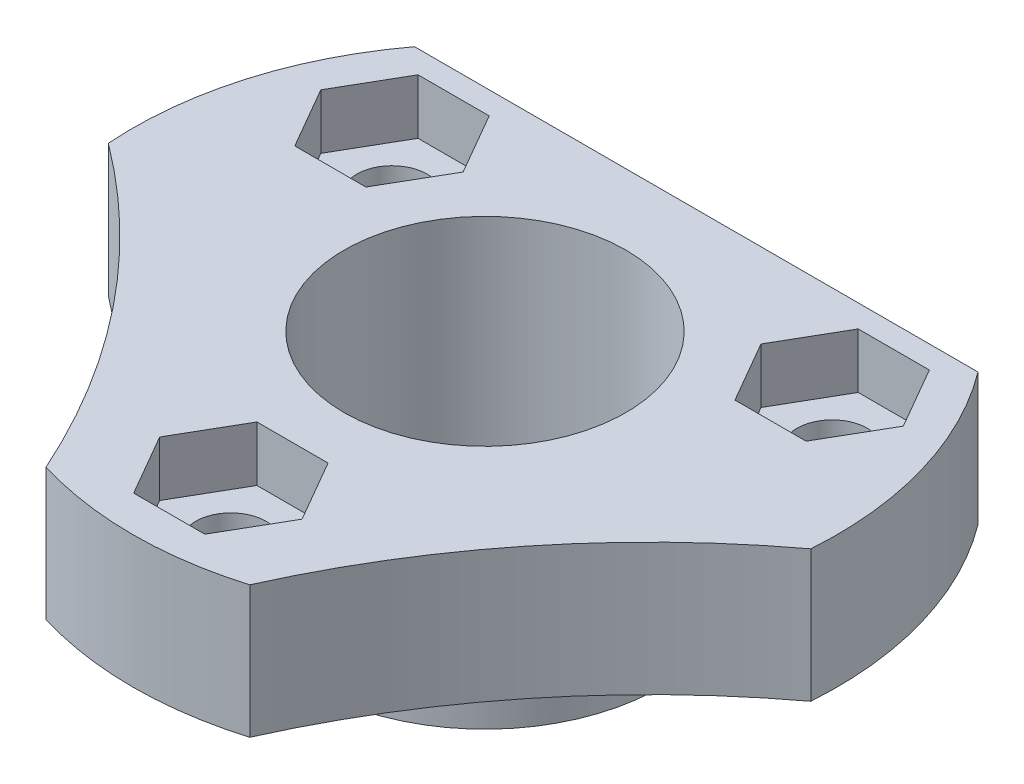
ISO-10303-21;
HEADER;
FILE_DESCRIPTION(('STEP AP214'),'2;1');
FILE_NAME('part.step','',(''),(''),'','','');
FILE_SCHEMA(('AUTOMOTIVE_DESIGN { 1 0 10303 214 1 1 1 1 }'));
ENDSEC;
DATA;
#1=APPLICATION_CONTEXT('core data for automotive mechanical design processes');
#2=APPLICATION_PROTOCOL_DEFINITION('international standard','automotive_design',2000,#1);
#3=PRODUCT_CONTEXT('',#1,'mechanical');
#4=PRODUCT('Part','Part','',(#3));
#5=PRODUCT_RELATED_PRODUCT_CATEGORY('part','',(#4));
#6=PRODUCT_DEFINITION_FORMATION('','',#4);
#7=PRODUCT_DEFINITION_CONTEXT('part definition',#1,'design');
#8=PRODUCT_DEFINITION('design','',#6,#7);
#9=PRODUCT_DEFINITION_SHAPE('','',#8);
#10=(LENGTH_UNIT() NAMED_UNIT(*) SI_UNIT(.MILLI.,.METRE.));
#11=(NAMED_UNIT(*) PLANE_ANGLE_UNIT() SI_UNIT($,.RADIAN.));
#12=(NAMED_UNIT(*) SI_UNIT($,.STERADIAN.) SOLID_ANGLE_UNIT());
#13=UNCERTAINTY_MEASURE_WITH_UNIT(LENGTH_MEASURE(1.E-05),#10,'distance_accuracy_value','');
#14=(GEOMETRIC_REPRESENTATION_CONTEXT(3) GLOBAL_UNCERTAINTY_ASSIGNED_CONTEXT((#13)) GLOBAL_UNIT_ASSIGNED_CONTEXT((#10,
#11,#12)) REPRESENTATION_CONTEXT('',''));
#15=CARTESIAN_POINT('',(0.,0.,0.));
#16=DIRECTION('',(0.,0.,1.));
#17=DIRECTION('',(1.,0.,0.));
#18=AXIS2_PLACEMENT_3D('',#15,#16,#17);
#19=CARTESIAN_POINT('',(0.,6.,11.5470053837925));
#20=DIRECTION('',(0.,-1.,0.));
#21=DIRECTION('',(0.,0.,-1.));
#22=AXIS2_PLACEMENT_3D('',#19,#20,#21);
#23=CYLINDRICAL_SURFACE('',#22,1.6);
#24=CARTESIAN_POINT('',(0.,0.,11.5470053837925));
#25=DIRECTION('',(0.,1.,0.));
#26=DIRECTION('',(0.,0.,1.));
#27=AXIS2_PLACEMENT_3D('',#24,#25,#26);
#28=CIRCLE('',#27,1.6);
#29=CARTESIAN_POINT('',(0.,0.,13.1470053837925));
#30=VERTEX_POINT('',#29);
#31=EDGE_CURVE('E368',#30,#30,#28,.T.);
#32=ORIENTED_EDGE('',*,*,#31,.F.);
#33=EDGE_LOOP('',(#32));
#34=FACE_BOUND('',#33,.T.);
#35=CARTESIAN_POINT('',(0.,3.5,11.5470053837925));
#36=DIRECTION('',(0.,1.,0.));
#37=DIRECTION('',(0.,0.,1.));
#38=AXIS2_PLACEMENT_3D('',#35,#36,#37);
#39=CIRCLE('',#38,1.6);
#40=CARTESIAN_POINT('',(0.,3.5,13.1470053837925));
#41=VERTEX_POINT('',#40);
#42=EDGE_CURVE('E36',#41,#41,#39,.T.);
#43=ORIENTED_EDGE('',*,*,#42,.T.);
#44=EDGE_LOOP('',(#43));
#45=FACE_BOUND('',#44,.T.);
#46=ADVANCED_FACE('F32',(#34,#45),#23,.F.);
#47=CARTESIAN_POINT('',(-10.,6.,-5.77350269189626));
#48=DIRECTION('',(0.,-1.,0.));
#49=DIRECTION('',(0.,0.,-1.));
#50=AXIS2_PLACEMENT_3D('',#47,#48,#49);
#51=CYLINDRICAL_SURFACE('',#50,1.6);
#52=CARTESIAN_POINT('',(-10.,0.,-5.77350269189626));
#53=DIRECTION('',(0.,1.,0.));
#54=DIRECTION('',(0.,0.,1.));
#55=AXIS2_PLACEMENT_3D('',#52,#53,#54);
#56=CIRCLE('',#55,1.6);
#57=CARTESIAN_POINT('',(-10.,0.,-4.17350269189626));
#58=VERTEX_POINT('',#57);
#59=EDGE_CURVE('E365',#58,#58,#56,.T.);
#60=ORIENTED_EDGE('',*,*,#59,.F.);
#61=EDGE_LOOP('',(#60));
#62=FACE_BOUND('',#61,.T.);
#63=CARTESIAN_POINT('',(-10.,3.5,-5.77350269189626));
#64=DIRECTION('',(0.,1.,0.));
#65=DIRECTION('',(0.,0.,1.));
#66=AXIS2_PLACEMENT_3D('',#63,#64,#65);
#67=CIRCLE('',#66,1.6);
#68=CARTESIAN_POINT('',(-10.,3.5,-4.17350269189626));
#69=VERTEX_POINT('',#68);
#70=EDGE_CURVE('E411',#69,#69,#67,.T.);
#71=ORIENTED_EDGE('',*,*,#70,.T.);
#72=EDGE_LOOP('',(#71));
#73=FACE_BOUND('',#72,.T.);
#74=ADVANCED_FACE('F480',(#62,#73),#51,.F.);
#75=CARTESIAN_POINT('',(10.,6.,-5.77350269189626));
#76=DIRECTION('',(0.,-1.,0.));
#77=DIRECTION('',(0.,0.,-1.));
#78=AXIS2_PLACEMENT_3D('',#75,#76,#77);
#79=CYLINDRICAL_SURFACE('',#78,1.6);
#80=CARTESIAN_POINT('',(10.,0.,-5.77350269189626));
#81=DIRECTION('',(0.,1.,0.));
#82=DIRECTION('',(0.,0.,1.));
#83=AXIS2_PLACEMENT_3D('',#80,#81,#82);
#84=CIRCLE('',#83,1.6);
#85=CARTESIAN_POINT('',(10.,0.,-4.17350269189626));
#86=VERTEX_POINT('',#85);
#87=EDGE_CURVE('E362',#86,#86,#84,.T.);
#88=ORIENTED_EDGE('',*,*,#87,.F.);
#89=EDGE_LOOP('',(#88));
#90=FACE_BOUND('',#89,.T.);
#91=CARTESIAN_POINT('',(10.,3.5,-5.77350269189626));
#92=DIRECTION('',(0.,1.,0.));
#93=DIRECTION('',(0.,0.,1.));
#94=AXIS2_PLACEMENT_3D('',#91,#92,#93);
#95=CIRCLE('',#94,1.6);
#96=CARTESIAN_POINT('',(10.,3.5,-4.17350269189626));
#97=VERTEX_POINT('',#96);
#98=EDGE_CURVE('E243',#97,#97,#95,.T.);
#99=ORIENTED_EDGE('',*,*,#98,.T.);
#100=EDGE_LOOP('',(#99));
#101=FACE_BOUND('',#100,.T.);
#102=ADVANCED_FACE('F485',(#90,#101),#79,.F.);
#103=CARTESIAN_POINT('',(0.,6.,0.));
#104=DIRECTION('',(0.,-1.,0.));
#105=DIRECTION('',(0.,0.,-1.));
#106=AXIS2_PLACEMENT_3D('',#103,#104,#105);
#107=CYLINDRICAL_SURFACE('',#106,16.);
#108=CARTESIAN_POINT('',(0.,6.,0.));
#109=DIRECTION('',(0.,1.,0.));
#110=DIRECTION('',(0.,0.,1.));
#111=AXIS2_PLACEMENT_3D('',#108,#109,#110);
#112=CIRCLE('',#111,16.);
#113=CARTESIAN_POINT('',(-12.8,6.,-9.6));
#114=VERTEX_POINT('',#113);
#115=CARTESIAN_POINT('',(-15.9581501555401,6.,1.15647897224159));
#116=VERTEX_POINT('',#115);
#117=EDGE_CURVE('E378',#114,#116,#112,.T.);
#118=ORIENTED_EDGE('',*,*,#117,.F.);
#119=DIRECTION('',(0.,-1.,0.));
#120=VECTOR('',#119,1.);
#121=CARTESIAN_POINT('',(-12.8,6.,-9.6));
#122=LINE('',#121,#120);
#123=CARTESIAN_POINT('',(-12.8,0.,-9.6));
#124=VERTEX_POINT('',#123);
#125=EDGE_CURVE('E11',#114,#124,#122,.T.);
#126=ORIENTED_EDGE('',*,*,#125,.T.);
#127=CARTESIAN_POINT('',(0.,0.,0.));
#128=DIRECTION('',(0.,1.,0.));
#129=DIRECTION('',(0.,0.,1.));
#130=AXIS2_PLACEMENT_3D('',#127,#128,#129);
#131=CIRCLE('',#130,16.);
#132=CARTESIAN_POINT('',(-15.9581501555401,0.,1.1564789722416));
#133=VERTEX_POINT('',#132);
#134=EDGE_CURVE('E383',#124,#133,#131,.T.);
#135=ORIENTED_EDGE('',*,*,#134,.T.);
#136=DIRECTION('',(0.,1.,0.));
#137=VECTOR('',#136,1.);
#138=CARTESIAN_POINT('',(-15.9581501555401,1.,1.1564789722416));
#139=LINE('',#138,#137);
#140=EDGE_CURVE('E405',#133,#116,#139,.T.);
#141=ORIENTED_EDGE('',*,*,#140,.T.);
#142=EDGE_LOOP('',(#118,#126,#135,#141));
#143=FACE_BOUND('',#142,.T.);
#144=ADVANCED_FACE('F476',(#143),#107,.T.);
#145=CARTESIAN_POINT('',(15.9581501555401,0.,1.15647897224158));
#146=VERTEX_POINT('',#145);
#147=CARTESIAN_POINT('',(12.8,0.,-9.6));
#148=VERTEX_POINT('',#147);
#149=EDGE_CURVE('E379',#146,#148,#131,.T.);
#150=ORIENTED_EDGE('',*,*,#149,.T.);
#151=DIRECTION('',(0.,-1.,0.));
#152=VECTOR('',#151,1.);
#153=CARTESIAN_POINT('',(12.8,6.,-9.6));
#154=LINE('',#153,#152);
#155=CARTESIAN_POINT('',(12.8,6.,-9.6));
#156=VERTEX_POINT('',#155);
#157=EDGE_CURVE('E41',#148,#156,#154,.F.);
#158=ORIENTED_EDGE('',*,*,#157,.T.);
#159=CARTESIAN_POINT('',(15.9581501555401,6.,1.15647897224158));
#160=VERTEX_POINT('',#159);
#161=EDGE_CURVE('E380',#160,#156,#112,.T.);
#162=ORIENTED_EDGE('',*,*,#161,.F.);
#163=DIRECTION('',(0.,1.,0.));
#164=VECTOR('',#163,1.);
#165=CARTESIAN_POINT('',(15.9581501555401,1.,1.15647897224158));
#166=LINE('',#165,#164);
#167=EDGE_CURVE('E396',#160,#146,#166,.F.);
#168=ORIENTED_EDGE('',*,*,#167,.T.);
#169=EDGE_LOOP('',(#150,#158,#162,#168));
#170=FACE_BOUND('',#169,.T.);
#171=ADVANCED_FACE('F477',(#170),#107,.T.);
#172=CARTESIAN_POINT('',(0.,0.,0.));
#173=DIRECTION('',(0.,1.,0.));
#174=DIRECTION('',(0.,0.,1.));
#175=AXIS2_PLACEMENT_3D('',#172,#173,#174);
#176=PLANE('',#175);
#177=CARTESIAN_POINT('',(0.,0.,0.));
#178=DIRECTION('',(0.,1.,0.));
#179=DIRECTION('',(0.,0.,1.));
#180=AXIS2_PLACEMENT_3D('',#177,#178,#179);
#181=CIRCLE('',#180,8.49999999999999);
#182=CARTESIAN_POINT('',(0.,0.,8.49999999999999));
#183=VERTEX_POINT('',#182);
#184=EDGE_CURVE('E387',#183,#183,#181,.T.);
#185=ORIENTED_EDGE('',*,*,#184,.T.);
#186=EDGE_LOOP('',(#185));
#187=FACE_BOUND('',#186,.T.);
#188=ORIENTED_EDGE('',*,*,#87,.T.);
#189=EDGE_LOOP('',(#188));
#190=FACE_BOUND('',#189,.T.);
#191=ORIENTED_EDGE('',*,*,#59,.T.);
#192=EDGE_LOOP('',(#191));
#193=FACE_BOUND('',#192,.T.);
#194=ORIENTED_EDGE('',*,*,#31,.T.);
#195=EDGE_LOOP('',(#194));
#196=FACE_BOUND('',#195,.T.);
#197=ORIENTED_EDGE('',*,*,#134,.F.);
#198=DIRECTION('',(1.,0.,0.));
#199=VECTOR('',#198,1.);
#200=CARTESIAN_POINT('',(0.,0.,-9.6));
#201=LINE('',#200,#199);
#202=EDGE_CURVE('E356',#124,#148,#201,.T.);
#203=ORIENTED_EDGE('',*,*,#202,.T.);
#204=ORIENTED_EDGE('',*,*,#149,.F.);
#205=CARTESIAN_POINT('',(37.5,0.,30.));
#206=DIRECTION('',(0.,1.,0.));
#207=DIRECTION('',(0.,0.,1.));
#208=AXIS2_PLACEMENT_3D('',#205,#206,#207);
#209=CIRCLE('',#208,36.);
#210=CARTESIAN_POINT('',(4.63128073876888,0.,15.3150657432056));
#211=VERTEX_POINT('',#210);
#212=EDGE_CURVE('E346',#146,#211,#209,.T.);
#213=ORIENTED_EDGE('',*,*,#212,.T.);
#214=CARTESIAN_POINT('',(-4.63128073876888,0.,15.3150657432056));
#215=VERTEX_POINT('',#214);
#216=EDGE_CURVE('E374',#215,#211,#131,.T.);
#217=ORIENTED_EDGE('',*,*,#216,.F.);
#218=CARTESIAN_POINT('',(-37.5,0.,30.));
#219=DIRECTION('',(0.,1.,0.));
#220=DIRECTION('',(0.,0.,1.));
#221=AXIS2_PLACEMENT_3D('',#218,#219,#220);
#222=CIRCLE('',#221,36.);
#223=EDGE_CURVE('E353',#215,#133,#222,.T.);
#224=ORIENTED_EDGE('',*,*,#223,.T.);
#225=EDGE_LOOP('',(#197,#203,#204,#213,#217,#224));
#226=FACE_BOUND('',#225,.T.);
#227=ADVANCED_FACE('F452',(#187,#190,#193,#196,#226),#176,.F.);
#228=CARTESIAN_POINT('',(0.,6.,0.));
#229=DIRECTION('',(0.,1.,0.));
#230=DIRECTION('',(0.,0.,1.));
#231=AXIS2_PLACEMENT_3D('',#228,#229,#230);
#232=PLANE('',#231);
#233=DIRECTION('',(1.,0.,0.));
#234=VECTOR('',#233,1.);
#235=CARTESIAN_POINT('',(-11.616580753731,6.,-2.97350269189626));
#236=LINE('',#235,#234);
#237=CARTESIAN_POINT('',(-11.616580753731,6.,-2.97350269189626));
#238=VERTEX_POINT('',#237);
#239=CARTESIAN_POINT('',(-8.38341924626905,6.,-2.97350269189626));
#240=VERTEX_POINT('',#239);
#241=EDGE_CURVE('E49',#238,#240,#236,.T.);
#242=ORIENTED_EDGE('',*,*,#241,.F.);
#243=DIRECTION('',(0.5,0.,0.866025403784439));
#244=VECTOR('',#243,1.);
#245=CARTESIAN_POINT('',(-13.2331615074619,6.,-5.77350269189626));
#246=LINE('',#245,#244);
#247=CARTESIAN_POINT('',(-13.2331615074619,6.,-5.77350269189626));
#248=VERTEX_POINT('',#247);
#249=EDGE_CURVE('E216',#248,#238,#246,.T.);
#250=ORIENTED_EDGE('',*,*,#249,.F.);
#251=DIRECTION('',(-0.5,0.,0.866025403784439));
#252=VECTOR('',#251,1.);
#253=CARTESIAN_POINT('',(-11.616580753731,6.,-8.57350269189626));
#254=LINE('',#253,#252);
#255=CARTESIAN_POINT('',(-11.616580753731,6.,-8.57350269189626));
#256=VERTEX_POINT('',#255);
#257=EDGE_CURVE('E219',#256,#248,#254,.T.);
#258=ORIENTED_EDGE('',*,*,#257,.F.);
#259=DIRECTION('',(-1.,0.,0.));
#260=VECTOR('',#259,1.);
#261=CARTESIAN_POINT('',(-8.38341924626905,6.,-8.57350269189626));
#262=LINE('',#261,#260);
#263=CARTESIAN_POINT('',(-8.38341924626905,6.,-8.57350269189626));
#264=VERTEX_POINT('',#263);
#265=EDGE_CURVE('E236',#264,#256,#262,.T.);
#266=ORIENTED_EDGE('',*,*,#265,.F.);
#267=DIRECTION('',(-0.5,0.,-0.866025403784439));
#268=VECTOR('',#267,1.);
#269=CARTESIAN_POINT('',(-6.7668384925381,6.,-5.77350269189626));
#270=LINE('',#269,#268);
#271=CARTESIAN_POINT('',(-6.7668384925381,6.,-5.77350269189626));
#272=VERTEX_POINT('',#271);
#273=EDGE_CURVE('E233',#272,#264,#270,.T.);
#274=ORIENTED_EDGE('',*,*,#273,.F.);
#275=DIRECTION('',(0.5,0.,-0.866025403784439));
#276=VECTOR('',#275,1.);
#277=CARTESIAN_POINT('',(-8.38341924626905,6.,-2.97350269189626));
#278=LINE('',#277,#276);
#279=EDGE_CURVE('E230',#240,#272,#278,.T.);
#280=ORIENTED_EDGE('',*,*,#279,.F.);
#281=EDGE_LOOP('',(#242,#250,#258,#266,#274,#280));
#282=FACE_BOUND('',#281,.T.);
#283=DIRECTION('',(1.,0.,0.));
#284=VECTOR('',#283,1.);
#285=CARTESIAN_POINT('',(8.38341924626905,6.,-2.97350269189626));
#286=LINE('',#285,#284);
#287=CARTESIAN_POINT('',(8.38341924626905,6.,-2.97350269189626));
#288=VERTEX_POINT('',#287);
#289=CARTESIAN_POINT('',(11.616580753731,6.,-2.97350269189626));
#290=VERTEX_POINT('',#289);
#291=EDGE_CURVE('E57',#288,#290,#286,.T.);
#292=ORIENTED_EDGE('',*,*,#291,.F.);
#293=DIRECTION('',(0.5,0.,0.866025403784439));
#294=VECTOR('',#293,1.);
#295=CARTESIAN_POINT('',(6.7668384925381,6.,-5.77350269189626));
#296=LINE('',#295,#294);
#297=CARTESIAN_POINT('',(6.7668384925381,6.,-5.77350269189626));
#298=VERTEX_POINT('',#297);
#299=EDGE_CURVE('E255',#298,#288,#296,.T.);
#300=ORIENTED_EDGE('',*,*,#299,.F.);
#301=DIRECTION('',(-0.5,0.,0.866025403784439));
#302=VECTOR('',#301,1.);
#303=CARTESIAN_POINT('',(8.38341924626905,6.,-8.57350269189626));
#304=LINE('',#303,#302);
#305=CARTESIAN_POINT('',(8.38341924626905,6.,-8.57350269189626));
#306=VERTEX_POINT('',#305);
#307=EDGE_CURVE('E282',#306,#298,#304,.T.);
#308=ORIENTED_EDGE('',*,*,#307,.F.);
#309=DIRECTION('',(-1.,0.,0.));
#310=VECTOR('',#309,1.);
#311=CARTESIAN_POINT('',(11.616580753731,6.,-8.57350269189626));
#312=LINE('',#311,#310);
#313=CARTESIAN_POINT('',(11.616580753731,6.,-8.57350269189626));
#314=VERTEX_POINT('',#313);
#315=EDGE_CURVE('E279',#314,#306,#312,.T.);
#316=ORIENTED_EDGE('',*,*,#315,.F.);
#317=DIRECTION('',(-0.5,0.,-0.866025403784439));
#318=VECTOR('',#317,1.);
#319=CARTESIAN_POINT('',(13.2331615074619,6.,-5.77350269189626));
#320=LINE('',#319,#318);
#321=CARTESIAN_POINT('',(13.2331615074619,6.,-5.77350269189626));
#322=VERTEX_POINT('',#321);
#323=EDGE_CURVE('E276',#322,#314,#320,.T.);
#324=ORIENTED_EDGE('',*,*,#323,.F.);
#325=DIRECTION('',(0.5,0.,-0.866025403784439));
#326=VECTOR('',#325,1.);
#327=CARTESIAN_POINT('',(11.616580753731,6.,-2.97350269189626));
#328=LINE('',#327,#326);
#329=EDGE_CURVE('E272',#290,#322,#328,.T.);
#330=ORIENTED_EDGE('',*,*,#329,.F.);
#331=EDGE_LOOP('',(#292,#300,#308,#316,#324,#330));
#332=FACE_BOUND('',#331,.T.);
#333=DIRECTION('',(1.,0.,0.));
#334=VECTOR('',#333,1.);
#335=CARTESIAN_POINT('',(-1.61658075373095,6.,14.3470053837925));
#336=LINE('',#335,#334);
#337=CARTESIAN_POINT('',(-1.61658075373095,6.,14.3470053837925));
#338=VERTEX_POINT('',#337);
#339=CARTESIAN_POINT('',(1.61658075373095,6.,14.3470053837925));
#340=VERTEX_POINT('',#339);
#341=EDGE_CURVE('E317',#338,#340,#336,.T.);
#342=ORIENTED_EDGE('',*,*,#341,.F.);
#343=DIRECTION('',(0.5,0.,0.866025403784439));
#344=VECTOR('',#343,1.);
#345=CARTESIAN_POINT('',(-3.2331615074619,6.,11.5470053837925));
#346=LINE('',#345,#344);
#347=CARTESIAN_POINT('',(-3.2331615074619,6.,11.5470053837925));
#348=VERTEX_POINT('',#347);
#349=EDGE_CURVE('E301',#348,#338,#346,.T.);
#350=ORIENTED_EDGE('',*,*,#349,.F.);
#351=DIRECTION('',(-0.5,0.,0.866025403784439));
#352=VECTOR('',#351,1.);
#353=CARTESIAN_POINT('',(-1.61658075373095,6.,8.74700538379252));
#354=LINE('',#353,#352);
#355=CARTESIAN_POINT('',(-1.61658075373095,6.,8.74700538379252));
#356=VERTEX_POINT('',#355);
#357=EDGE_CURVE('E328',#356,#348,#354,.T.);
#358=ORIENTED_EDGE('',*,*,#357,.F.);
#359=DIRECTION('',(-1.,0.,0.));
#360=VECTOR('',#359,1.);
#361=CARTESIAN_POINT('',(1.61658075373095,6.,8.74700538379252));
#362=LINE('',#361,#360);
#363=CARTESIAN_POINT('',(1.61658075373095,6.,8.74700538379252));
#364=VERTEX_POINT('',#363);
#365=EDGE_CURVE('E325',#364,#356,#362,.T.);
#366=ORIENTED_EDGE('',*,*,#365,.F.);
#367=DIRECTION('',(-0.5,0.,-0.866025403784439));
#368=VECTOR('',#367,1.);
#369=CARTESIAN_POINT('',(3.2331615074619,6.,11.5470053837925));
#370=LINE('',#369,#368);
#371=CARTESIAN_POINT('',(3.2331615074619,6.,11.5470053837925));
#372=VERTEX_POINT('',#371);
#373=EDGE_CURVE('E322',#372,#364,#370,.T.);
#374=ORIENTED_EDGE('',*,*,#373,.F.);
#375=DIRECTION('',(0.5,0.,-0.866025403784439));
#376=VECTOR('',#375,1.);
#377=CARTESIAN_POINT('',(1.61658075373095,6.,14.3470053837925));
#378=LINE('',#377,#376);
#379=EDGE_CURVE('E319',#340,#372,#378,.T.);
#380=ORIENTED_EDGE('',*,*,#379,.F.);
#381=EDGE_LOOP('',(#342,#350,#358,#366,#374,#380));
#382=FACE_BOUND('',#381,.T.);
#383=DIRECTION('',(1.,0.,0.));
#384=VECTOR('',#383,1.);
#385=CARTESIAN_POINT('',(-32.5116336952097,6.,-9.6));
#386=LINE('',#385,#384);
#387=EDGE_CURVE('E344',#114,#156,#386,.T.);
#388=ORIENTED_EDGE('',*,*,#387,.F.);
#389=ORIENTED_EDGE('',*,*,#117,.T.);
#390=CARTESIAN_POINT('',(-37.5,6.,30.));
#391=DIRECTION('',(0.,1.,0.));
#392=DIRECTION('',(0.,0.,1.));
#393=AXIS2_PLACEMENT_3D('',#390,#391,#392);
#394=CIRCLE('',#393,36.);
#395=CARTESIAN_POINT('',(-4.63128073876888,6.,15.3150657432056));
#396=VERTEX_POINT('',#395);
#397=EDGE_CURVE('E347',#396,#116,#394,.T.);
#398=ORIENTED_EDGE('',*,*,#397,.F.);
#399=CARTESIAN_POINT('',(4.63128073876887,6.,15.3150657432056));
#400=VERTEX_POINT('',#399);
#401=EDGE_CURVE('E375',#396,#400,#112,.T.);
#402=ORIENTED_EDGE('',*,*,#401,.T.);
#403=CARTESIAN_POINT('',(37.5,6.,30.));
#404=DIRECTION('',(0.,1.,0.));
#405=DIRECTION('',(0.,0.,1.));
#406=AXIS2_PLACEMENT_3D('',#403,#404,#405);
#407=CIRCLE('',#406,36.);
#408=EDGE_CURVE('E349',#160,#400,#407,.T.);
#409=ORIENTED_EDGE('',*,*,#408,.F.);
#410=ORIENTED_EDGE('',*,*,#161,.T.);
#411=EDGE_LOOP('',(#388,#389,#398,#402,#409,#410));
#412=FACE_BOUND('',#411,.T.);
#413=CARTESIAN_POINT('',(0.,6.,0.));
#414=DIRECTION('',(0.,1.,0.));
#415=DIRECTION('',(0.,0.,1.));
#416=AXIS2_PLACEMENT_3D('',#413,#414,#415);
#417=CIRCLE('',#416,6.4);
#418=CARTESIAN_POINT('',(0.,6.,6.4));
#419=VERTEX_POINT('',#418);
#420=EDGE_CURVE('E371',#419,#419,#417,.T.);
#421=ORIENTED_EDGE('',*,*,#420,.F.);
#422=EDGE_LOOP('',(#421));
#423=FACE_BOUND('',#422,.T.);
#424=ADVANCED_FACE('F448',(#282,#332,#382,#412,#423),#232,.T.);
#425=ORIENTED_EDGE('',*,*,#401,.F.);
#426=DIRECTION('',(0.,1.,0.));
#427=VECTOR('',#426,1.);
#428=CARTESIAN_POINT('',(-4.63128073876889,1.,15.3150657432056));
#429=LINE('',#428,#427);
#430=EDGE_CURVE('E402',#396,#215,#429,.F.);
#431=ORIENTED_EDGE('',*,*,#430,.T.);
#432=ORIENTED_EDGE('',*,*,#216,.T.);
#433=DIRECTION('',(0.,1.,0.));
#434=VECTOR('',#433,1.);
#435=CARTESIAN_POINT('',(4.63128073876887,1.,15.3150657432056));
#436=LINE('',#435,#434);
#437=EDGE_CURVE('E399',#211,#400,#436,.T.);
#438=ORIENTED_EDGE('',*,*,#437,.T.);
#439=EDGE_LOOP('',(#425,#431,#432,#438));
#440=FACE_BOUND('',#439,.T.);
#441=ADVANCED_FACE('F451',(#440),#107,.T.);
#442=CARTESIAN_POINT('',(0.,6.,0.));
#443=DIRECTION('',(0.,-1.,0.));
#444=DIRECTION('',(0.,0.,-1.));
#445=AXIS2_PLACEMENT_3D('',#442,#443,#444);
#446=CYLINDRICAL_SURFACE('',#445,6.4);
#447=CARTESIAN_POINT('',(0.,-3.49999999999999,0.));
#448=DIRECTION('',(0.,-1.,0.));
#449=DIRECTION('',(0.,0.,-1.));
#450=AXIS2_PLACEMENT_3D('',#447,#448,#449);
#451=CIRCLE('',#450,6.4);
#452=CARTESIAN_POINT('',(0.,-3.49999999999999,-6.4));
#453=VERTEX_POINT('',#452);
#454=EDGE_CURVE('E390',#453,#453,#451,.T.);
#455=ORIENTED_EDGE('',*,*,#454,.T.);
#456=EDGE_LOOP('',(#455));
#457=FACE_BOUND('',#456,.T.);
#458=ORIENTED_EDGE('',*,*,#420,.T.);
#459=EDGE_LOOP('',(#458));
#460=FACE_BOUND('',#459,.T.);
#461=ADVANCED_FACE('F462',(#457,#460),#446,.F.);
#462=CARTESIAN_POINT('',(0.,-4.,0.));
#463=DIRECTION('',(0.,-1.,0.));
#464=DIRECTION('',(0.,0.,-1.));
#465=AXIS2_PLACEMENT_3D('',#462,#463,#464);
#466=PLANE('',#465);
#467=CARTESIAN_POINT('',(0.,-4.,0.));
#468=DIRECTION('',(0.,-1.,0.));
#469=DIRECTION('',(0.,0.,-1.));
#470=AXIS2_PLACEMENT_3D('',#467,#468,#469);
#471=CIRCLE('',#470,6.90000000000002);
#472=CARTESIAN_POINT('',(0.,-4.,-6.90000000000002));
#473=VERTEX_POINT('',#472);
#474=EDGE_CURVE('E393',#473,#473,#471,.F.);
#475=ORIENTED_EDGE('',*,*,#474,.T.);
#476=EDGE_LOOP('',(#475));
#477=FACE_BOUND('',#476,.T.);
#478=CARTESIAN_POINT('',(0.,-4.,0.));
#479=DIRECTION('',(0.,-1.,0.));
#480=DIRECTION('',(0.,0.,-1.));
#481=AXIS2_PLACEMENT_3D('',#478,#479,#480);
#482=CIRCLE('',#481,8.);
#483=CARTESIAN_POINT('',(0.,-4.,-8.));
#484=VERTEX_POINT('',#483);
#485=EDGE_CURVE('E359',#484,#484,#482,.T.);
#486=ORIENTED_EDGE('',*,*,#485,.T.);
#487=EDGE_LOOP('',(#486));
#488=FACE_BOUND('',#487,.T.);
#489=ADVANCED_FACE('F464',(#477,#488),#466,.T.);
#490=CARTESIAN_POINT('',(0.,-4.,0.));
#491=DIRECTION('',(0.,1.,0.));
#492=DIRECTION('',(0.,0.,1.));
#493=AXIS2_PLACEMENT_3D('',#490,#491,#492);
#494=CYLINDRICAL_SURFACE('',#493,8.);
#495=CARTESIAN_POINT('',(0.,-0.5,0.));
#496=DIRECTION('',(0.,1.,0.));
#497=DIRECTION('',(0.,0.,1.));
#498=AXIS2_PLACEMENT_3D('',#495,#496,#497);
#499=CIRCLE('',#498,8.);
#500=CARTESIAN_POINT('',(0.,-0.5,8.));
#501=VERTEX_POINT('',#500);
#502=EDGE_CURVE('E384',#501,#501,#499,.F.);
#503=ORIENTED_EDGE('',*,*,#502,.T.);
#504=EDGE_LOOP('',(#503));
#505=FACE_BOUND('',#504,.T.);
#506=ORIENTED_EDGE('',*,*,#485,.F.);
#507=EDGE_LOOP('',(#506));
#508=FACE_BOUND('',#507,.T.);
#509=ADVANCED_FACE('F471',(#505,#508),#494,.T.);
#510=CARTESIAN_POINT('',(0.,-0.5,0.));
#511=DIRECTION('',(0.,1.,0.));
#512=DIRECTION('',(0.,0.,1.));
#513=AXIS2_PLACEMENT_3D('',#510,#511,#512);
#514=CONICAL_SURFACE('',#513,8.,0.785398163397441);
#515=ORIENTED_EDGE('',*,*,#184,.F.);
#516=EDGE_LOOP('',(#515));
#517=FACE_BOUND('',#516,.T.);
#518=ORIENTED_EDGE('',*,*,#502,.F.);
#519=EDGE_LOOP('',(#518));
#520=FACE_BOUND('',#519,.T.);
#521=ADVANCED_FACE('F494',(#517,#520),#514,.T.);
#522=CARTESIAN_POINT('',(0.,-3.49999999999999,0.));
#523=DIRECTION('',(0.,-1.,0.));
#524=DIRECTION('',(0.,0.,-1.));
#525=AXIS2_PLACEMENT_3D('',#522,#523,#524);
#526=CONICAL_SURFACE('',#525,6.4,0.785398163397454);
#527=ORIENTED_EDGE('',*,*,#474,.F.);
#528=EDGE_LOOP('',(#527));
#529=FACE_BOUND('',#528,.T.);
#530=ORIENTED_EDGE('',*,*,#454,.F.);
#531=EDGE_LOOP('',(#530));
#532=FACE_BOUND('',#531,.T.);
#533=ADVANCED_FACE('F34',(#529,#532),#526,.F.);
#534=CARTESIAN_POINT('',(37.5,-4.,30.));
#535=DIRECTION('',(0.,1.,0.));
#536=DIRECTION('',(0.,0.,1.));
#537=AXIS2_PLACEMENT_3D('',#534,#535,#536);
#538=CYLINDRICAL_SURFACE('',#537,36.);
#539=ORIENTED_EDGE('',*,*,#212,.F.);
#540=ORIENTED_EDGE('',*,*,#167,.F.);
#541=ORIENTED_EDGE('',*,*,#408,.T.);
#542=ORIENTED_EDGE('',*,*,#437,.F.);
#543=EDGE_LOOP('',(#539,#540,#541,#542));
#544=FACE_BOUND('',#543,.T.);
#545=ADVANCED_FACE('F497',(#544),#538,.F.);
#546=CARTESIAN_POINT('',(-37.5,-4.,30.));
#547=DIRECTION('',(0.,1.,0.));
#548=DIRECTION('',(0.,0.,1.));
#549=AXIS2_PLACEMENT_3D('',#546,#547,#548);
#550=CYLINDRICAL_SURFACE('',#549,36.);
#551=ORIENTED_EDGE('',*,*,#223,.F.);
#552=ORIENTED_EDGE('',*,*,#430,.F.);
#553=ORIENTED_EDGE('',*,*,#397,.T.);
#554=ORIENTED_EDGE('',*,*,#140,.F.);
#555=EDGE_LOOP('',(#551,#552,#553,#554));
#556=FACE_BOUND('',#555,.T.);
#557=ADVANCED_FACE('F500',(#556),#550,.F.);
#558=CARTESIAN_POINT('',(-32.5116336952097,-4.,-9.6));
#559=DIRECTION('',(0.,0.,1.));
#560=DIRECTION('',(1.,0.,0.));
#561=AXIS2_PLACEMENT_3D('',#558,#559,#560);
#562=PLANE('',#561);
#563=ORIENTED_EDGE('',*,*,#387,.T.);
#564=ORIENTED_EDGE('',*,*,#157,.F.);
#565=ORIENTED_EDGE('',*,*,#202,.F.);
#566=ORIENTED_EDGE('',*,*,#125,.F.);
#567=EDGE_LOOP('',(#563,#564,#565,#566));
#568=FACE_BOUND('',#567,.T.);
#569=ADVANCED_FACE('F504',(#568),#562,.F.);
#570=CARTESIAN_POINT('',(8.38341924626905,3.5,-2.97350269189626));
#571=DIRECTION('',(0.,0.,1.));
#572=DIRECTION('',(1.,0.,0.));
#573=AXIS2_PLACEMENT_3D('',#570,#571,#572);
#574=PLANE('',#573);
#575=ORIENTED_EDGE('',*,*,#291,.T.);
#576=DIRECTION('',(0.,1.,0.));
#577=VECTOR('',#576,1.);
#578=CARTESIAN_POINT('',(11.616580753731,3.5,-2.97350269189626));
#579=LINE('',#578,#577);
#580=CARTESIAN_POINT('',(11.616580753731,3.5,-2.97350269189626));
#581=VERTEX_POINT('',#580);
#582=EDGE_CURVE('E270',#581,#290,#579,.T.);
#583=ORIENTED_EDGE('',*,*,#582,.F.);
#584=DIRECTION('',(1.,0.,0.));
#585=VECTOR('',#584,1.);
#586=CARTESIAN_POINT('',(8.38341924626905,3.5,-2.97350269189626));
#587=LINE('',#586,#585);
#588=CARTESIAN_POINT('',(8.38341924626905,3.5,-2.97350269189626));
#589=VERTEX_POINT('',#588);
#590=EDGE_CURVE('E251',#589,#581,#587,.T.);
#591=ORIENTED_EDGE('',*,*,#590,.F.);
#592=DIRECTION('',(0.,1.,0.));
#593=VECTOR('',#592,1.);
#594=CARTESIAN_POINT('',(8.38341924626905,3.5,-2.97350269189626));
#595=LINE('',#594,#593);
#596=EDGE_CURVE('E231',#589,#288,#595,.T.);
#597=ORIENTED_EDGE('',*,*,#596,.T.);
#598=EDGE_LOOP('',(#575,#583,#591,#597));
#599=FACE_BOUND('',#598,.T.);
#600=ADVANCED_FACE('F508',(#599),#574,.F.);
#601=CARTESIAN_POINT('',(6.7668384925381,3.5,-5.77350269189626));
#602=DIRECTION('',(-0.866025403784439,0.,0.5));
#603=DIRECTION('',(0.5,0.,0.866025403784439));
#604=AXIS2_PLACEMENT_3D('',#601,#602,#603);
#605=PLANE('',#604);
#606=ORIENTED_EDGE('',*,*,#299,.T.);
#607=ORIENTED_EDGE('',*,*,#596,.F.);
#608=DIRECTION('',(0.5,0.,0.866025403784439));
#609=VECTOR('',#608,1.);
#610=CARTESIAN_POINT('',(6.7668384925381,3.5,-5.77350269189626));
#611=LINE('',#610,#609);
#612=CARTESIAN_POINT('',(6.7668384925381,3.5,-5.77350269189626));
#613=VERTEX_POINT('',#612);
#614=EDGE_CURVE('E267',#613,#589,#611,.T.);
#615=ORIENTED_EDGE('',*,*,#614,.F.);
#616=DIRECTION('',(0.,1.,0.));
#617=VECTOR('',#616,1.);
#618=CARTESIAN_POINT('',(6.7668384925381,3.5,-5.77350269189626));
#619=LINE('',#618,#617);
#620=EDGE_CURVE('E288',#613,#298,#619,.T.);
#621=ORIENTED_EDGE('',*,*,#620,.T.);
#622=EDGE_LOOP('',(#606,#607,#615,#621));
#623=FACE_BOUND('',#622,.T.);
#624=ADVANCED_FACE('F524',(#623),#605,.F.);
#625=CARTESIAN_POINT('',(8.38341924626905,3.5,-8.57350269189626));
#626=DIRECTION('',(-0.866025403784439,0.,-0.5));
#627=DIRECTION('',(-0.5,0.,0.866025403784439));
#628=AXIS2_PLACEMENT_3D('',#625,#626,#627);
#629=PLANE('',#628);
#630=ORIENTED_EDGE('',*,*,#307,.T.);
#631=ORIENTED_EDGE('',*,*,#620,.F.);
#632=DIRECTION('',(-0.5,0.,0.866025403784439));
#633=VECTOR('',#632,1.);
#634=CARTESIAN_POINT('',(8.38341924626905,3.5,-8.57350269189626));
#635=LINE('',#634,#633);
#636=CARTESIAN_POINT('',(8.38341924626905,3.5,-8.57350269189626));
#637=VERTEX_POINT('',#636);
#638=EDGE_CURVE('E264',#637,#613,#635,.T.);
#639=ORIENTED_EDGE('',*,*,#638,.F.);
#640=DIRECTION('',(0.,1.,0.));
#641=VECTOR('',#640,1.);
#642=CARTESIAN_POINT('',(8.38341924626905,3.5,-8.57350269189626));
#643=LINE('',#642,#641);
#644=EDGE_CURVE('E290',#637,#306,#643,.T.);
#645=ORIENTED_EDGE('',*,*,#644,.T.);
#646=EDGE_LOOP('',(#630,#631,#639,#645));
#647=FACE_BOUND('',#646,.T.);
#648=ADVANCED_FACE('F537',(#647),#629,.F.);
#649=CARTESIAN_POINT('',(11.616580753731,3.5,-8.57350269189626));
#650=DIRECTION('',(0.,0.,-1.));
#651=DIRECTION('',(-1.,0.,0.));
#652=AXIS2_PLACEMENT_3D('',#649,#650,#651);
#653=PLANE('',#652);
#654=ORIENTED_EDGE('',*,*,#315,.T.);
#655=ORIENTED_EDGE('',*,*,#644,.F.);
#656=DIRECTION('',(-1.,0.,0.));
#657=VECTOR('',#656,1.);
#658=CARTESIAN_POINT('',(11.616580753731,3.5,-8.57350269189626));
#659=LINE('',#658,#657);
#660=CARTESIAN_POINT('',(11.616580753731,3.5,-8.57350269189626));
#661=VERTEX_POINT('',#660);
#662=EDGE_CURVE('E261',#661,#637,#659,.T.);
#663=ORIENTED_EDGE('',*,*,#662,.F.);
#664=DIRECTION('',(0.,1.,0.));
#665=VECTOR('',#664,1.);
#666=CARTESIAN_POINT('',(11.616580753731,3.5,-8.57350269189626));
#667=LINE('',#666,#665);
#668=EDGE_CURVE('E292',#661,#314,#667,.T.);
#669=ORIENTED_EDGE('',*,*,#668,.T.);
#670=EDGE_LOOP('',(#654,#655,#663,#669));
#671=FACE_BOUND('',#670,.T.);
#672=ADVANCED_FACE('F533',(#671),#653,.F.);
#673=CARTESIAN_POINT('',(13.2331615074619,3.5,-5.77350269189626));
#674=DIRECTION('',(0.866025403784439,0.,-0.5));
#675=DIRECTION('',(-0.5,0.,-0.866025403784439));
#676=AXIS2_PLACEMENT_3D('',#673,#674,#675);
#677=PLANE('',#676);
#678=ORIENTED_EDGE('',*,*,#323,.T.);
#679=ORIENTED_EDGE('',*,*,#668,.F.);
#680=DIRECTION('',(-0.5,0.,-0.866025403784439));
#681=VECTOR('',#680,1.);
#682=CARTESIAN_POINT('',(13.2331615074619,3.5,-5.77350269189626));
#683=LINE('',#682,#681);
#684=CARTESIAN_POINT('',(13.2331615074619,3.5,-5.77350269189626));
#685=VERTEX_POINT('',#684);
#686=EDGE_CURVE('E258',#685,#661,#683,.T.);
#687=ORIENTED_EDGE('',*,*,#686,.F.);
#688=DIRECTION('',(0.,1.,0.));
#689=VECTOR('',#688,1.);
#690=CARTESIAN_POINT('',(13.2331615074619,3.5,-5.77350269189626));
#691=LINE('',#690,#689);
#692=EDGE_CURVE('E294',#685,#322,#691,.T.);
#693=ORIENTED_EDGE('',*,*,#692,.T.);
#694=EDGE_LOOP('',(#678,#679,#687,#693));
#695=FACE_BOUND('',#694,.T.);
#696=ADVANCED_FACE('F529',(#695),#677,.F.);
#697=CARTESIAN_POINT('',(11.616580753731,3.5,-2.97350269189626));
#698=DIRECTION('',(0.866025403784439,0.,0.5));
#699=DIRECTION('',(0.5,0.,-0.866025403784439));
#700=AXIS2_PLACEMENT_3D('',#697,#698,#699);
#701=PLANE('',#700);
#702=ORIENTED_EDGE('',*,*,#329,.T.);
#703=ORIENTED_EDGE('',*,*,#692,.F.);
#704=DIRECTION('',(0.5,0.,-0.866025403784439));
#705=VECTOR('',#704,1.);
#706=CARTESIAN_POINT('',(11.616580753731,3.5,-2.97350269189626));
#707=LINE('',#706,#705);
#708=EDGE_CURVE('E254',#581,#685,#707,.T.);
#709=ORIENTED_EDGE('',*,*,#708,.F.);
#710=ORIENTED_EDGE('',*,*,#582,.T.);
#711=EDGE_LOOP('',(#702,#703,#709,#710));
#712=FACE_BOUND('',#711,.T.);
#713=ADVANCED_FACE('F525',(#712),#701,.F.);
#714=CARTESIAN_POINT('',(0.,3.5,0.));
#715=DIRECTION('',(0.,1.,0.));
#716=DIRECTION('',(0.,0.,1.));
#717=AXIS2_PLACEMENT_3D('',#714,#715,#716);
#718=PLANE('',#717);
#719=ORIENTED_EDGE('',*,*,#98,.F.);
#720=EDGE_LOOP('',(#719));
#721=FACE_BOUND('',#720,.T.);
#722=ORIENTED_EDGE('',*,*,#590,.T.);
#723=ORIENTED_EDGE('',*,*,#708,.T.);
#724=ORIENTED_EDGE('',*,*,#686,.T.);
#725=ORIENTED_EDGE('',*,*,#662,.T.);
#726=ORIENTED_EDGE('',*,*,#638,.T.);
#727=ORIENTED_EDGE('',*,*,#614,.T.);
#728=EDGE_LOOP('',(#722,#723,#724,#725,#726,#727));
#729=FACE_BOUND('',#728,.T.);
#730=ADVANCED_FACE('F528',(#721,#729),#718,.T.);
#731=CARTESIAN_POINT('',(-11.616580753731,3.5,-2.97350269189626));
#732=DIRECTION('',(0.,0.,1.));
#733=DIRECTION('',(1.,0.,0.));
#734=AXIS2_PLACEMENT_3D('',#731,#732,#733);
#735=PLANE('',#734);
#736=ORIENTED_EDGE('',*,*,#241,.T.);
#737=DIRECTION('',(0.,1.,0.));
#738=VECTOR('',#737,1.);
#739=CARTESIAN_POINT('',(-8.38341924626905,3.5,-2.97350269189626));
#740=LINE('',#739,#738);
#741=CARTESIAN_POINT('',(-8.38341924626905,3.5,-2.97350269189626));
#742=VERTEX_POINT('',#741);
#743=EDGE_CURVE('E193',#742,#240,#740,.T.);
#744=ORIENTED_EDGE('',*,*,#743,.F.);
#745=DIRECTION('',(1.,0.,0.));
#746=VECTOR('',#745,1.);
#747=CARTESIAN_POINT('',(-11.616580753731,3.5,-2.97350269189626));
#748=LINE('',#747,#746);
#749=CARTESIAN_POINT('',(-11.616580753731,3.5,-2.97350269189626));
#750=VERTEX_POINT('',#749);
#751=EDGE_CURVE('E197',#750,#742,#748,.T.);
#752=ORIENTED_EDGE('',*,*,#751,.F.);
#753=DIRECTION('',(0.,1.,0.));
#754=VECTOR('',#753,1.);
#755=CARTESIAN_POINT('',(-11.616580753731,3.5,-2.97350269189626));
#756=LINE('',#755,#754);
#757=EDGE_CURVE('E241',#750,#238,#756,.T.);
#758=ORIENTED_EDGE('',*,*,#757,.T.);
#759=EDGE_LOOP('',(#736,#744,#752,#758));
#760=FACE_BOUND('',#759,.T.);
#761=ADVANCED_FACE('F195',(#760),#735,.F.);
#762=CARTESIAN_POINT('',(-13.2331615074619,3.5,-5.77350269189626));
#763=DIRECTION('',(-0.866025403784439,0.,0.5));
#764=DIRECTION('',(0.5,0.,0.866025403784439));
#765=AXIS2_PLACEMENT_3D('',#762,#763,#764);
#766=PLANE('',#765);
#767=ORIENTED_EDGE('',*,*,#249,.T.);
#768=ORIENTED_EDGE('',*,*,#757,.F.);
#769=DIRECTION('',(0.5,0.,0.866025403784439));
#770=VECTOR('',#769,1.);
#771=CARTESIAN_POINT('',(-13.2331615074619,3.5,-5.77350269189626));
#772=LINE('',#771,#770);
#773=CARTESIAN_POINT('',(-13.2331615074619,3.5,-5.77350269189626));
#774=VERTEX_POINT('',#773);
#775=EDGE_CURVE('E203',#774,#750,#772,.T.);
#776=ORIENTED_EDGE('',*,*,#775,.F.);
#777=DIRECTION('',(0.,1.,0.));
#778=VECTOR('',#777,1.);
#779=CARTESIAN_POINT('',(-13.2331615074619,3.5,-5.77350269189626));
#780=LINE('',#779,#778);
#781=EDGE_CURVE('E244',#774,#248,#780,.T.);
#782=ORIENTED_EDGE('',*,*,#781,.T.);
#783=EDGE_LOOP('',(#767,#768,#776,#782));
#784=FACE_BOUND('',#783,.T.);
#785=ADVANCED_FACE('F550',(#784),#766,.F.);
#786=CARTESIAN_POINT('',(-11.616580753731,3.5,-8.57350269189626));
#787=DIRECTION('',(-0.866025403784439,0.,-0.5));
#788=DIRECTION('',(-0.5,0.,0.866025403784439));
#789=AXIS2_PLACEMENT_3D('',#786,#787,#788);
#790=PLANE('',#789);
#791=ORIENTED_EDGE('',*,*,#257,.T.);
#792=ORIENTED_EDGE('',*,*,#781,.F.);
#793=DIRECTION('',(-0.5,0.,0.866025403784439));
#794=VECTOR('',#793,1.);
#795=CARTESIAN_POINT('',(-11.616580753731,3.5,-8.57350269189626));
#796=LINE('',#795,#794);
#797=CARTESIAN_POINT('',(-11.616580753731,3.5,-8.57350269189626));
#798=VERTEX_POINT('',#797);
#799=EDGE_CURVE('E226',#798,#774,#796,.T.);
#800=ORIENTED_EDGE('',*,*,#799,.F.);
#801=DIRECTION('',(0.,1.,0.));
#802=VECTOR('',#801,1.);
#803=CARTESIAN_POINT('',(-11.616580753731,3.5,-8.57350269189626));
#804=LINE('',#803,#802);
#805=EDGE_CURVE('E246',#798,#256,#804,.T.);
#806=ORIENTED_EDGE('',*,*,#805,.T.);
#807=EDGE_LOOP('',(#791,#792,#800,#806));
#808=FACE_BOUND('',#807,.T.);
#809=ADVANCED_FACE('F560',(#808),#790,.F.);
#810=CARTESIAN_POINT('',(-8.38341924626905,3.5,-8.57350269189626));
#811=DIRECTION('',(0.,0.,-1.));
#812=DIRECTION('',(-1.,0.,0.));
#813=AXIS2_PLACEMENT_3D('',#810,#811,#812);
#814=PLANE('',#813);
#815=ORIENTED_EDGE('',*,*,#265,.T.);
#816=ORIENTED_EDGE('',*,*,#805,.F.);
#817=DIRECTION('',(-1.,0.,0.));
#818=VECTOR('',#817,1.);
#819=CARTESIAN_POINT('',(-8.38341924626905,3.5,-8.57350269189626));
#820=LINE('',#819,#818);
#821=CARTESIAN_POINT('',(-8.38341924626905,3.5,-8.57350269189626));
#822=VERTEX_POINT('',#821);
#823=EDGE_CURVE('E223',#822,#798,#820,.T.);
#824=ORIENTED_EDGE('',*,*,#823,.F.);
#825=DIRECTION('',(0.,1.,0.));
#826=VECTOR('',#825,1.);
#827=CARTESIAN_POINT('',(-8.38341924626905,3.5,-8.57350269189626));
#828=LINE('',#827,#826);
#829=EDGE_CURVE('E248',#822,#264,#828,.T.);
#830=ORIENTED_EDGE('',*,*,#829,.T.);
#831=EDGE_LOOP('',(#815,#816,#824,#830));
#832=FACE_BOUND('',#831,.T.);
#833=ADVANCED_FACE('F556',(#832),#814,.F.);
#834=CARTESIAN_POINT('',(-6.7668384925381,3.5,-5.77350269189626));
#835=DIRECTION('',(0.866025403784439,0.,-0.5));
#836=DIRECTION('',(-0.5,0.,-0.866025403784439));
#837=AXIS2_PLACEMENT_3D('',#834,#835,#836);
#838=PLANE('',#837);
#839=ORIENTED_EDGE('',*,*,#273,.T.);
#840=ORIENTED_EDGE('',*,*,#829,.F.);
#841=DIRECTION('',(-0.5,0.,-0.866025403784439));
#842=VECTOR('',#841,1.);
#843=CARTESIAN_POINT('',(-6.7668384925381,3.5,-5.77350269189626));
#844=LINE('',#843,#842);
#845=CARTESIAN_POINT('',(-6.7668384925381,3.5,-5.77350269189626));
#846=VERTEX_POINT('',#845);
#847=EDGE_CURVE('E211',#846,#822,#844,.T.);
#848=ORIENTED_EDGE('',*,*,#847,.F.);
#849=DIRECTION('',(0.,1.,0.));
#850=VECTOR('',#849,1.);
#851=CARTESIAN_POINT('',(-6.7668384925381,3.5,-5.77350269189626));
#852=LINE('',#851,#850);
#853=EDGE_CURVE('E202',#846,#272,#852,.T.);
#854=ORIENTED_EDGE('',*,*,#853,.T.);
#855=EDGE_LOOP('',(#839,#840,#848,#854));
#856=FACE_BOUND('',#855,.T.);
#857=ADVANCED_FACE('F553',(#856),#838,.F.);
#858=CARTESIAN_POINT('',(-8.38341924626905,3.5,-2.97350269189626));
#859=DIRECTION('',(0.866025403784439,0.,0.5));
#860=DIRECTION('',(0.5,0.,-0.866025403784439));
#861=AXIS2_PLACEMENT_3D('',#858,#859,#860);
#862=PLANE('',#861);
#863=ORIENTED_EDGE('',*,*,#279,.T.);
#864=ORIENTED_EDGE('',*,*,#853,.F.);
#865=DIRECTION('',(0.5,0.,-0.866025403784439));
#866=VECTOR('',#865,1.);
#867=CARTESIAN_POINT('',(-8.38341924626905,3.5,-2.97350269189626));
#868=LINE('',#867,#866);
#869=EDGE_CURVE('E206',#742,#846,#868,.T.);
#870=ORIENTED_EDGE('',*,*,#869,.F.);
#871=ORIENTED_EDGE('',*,*,#743,.T.);
#872=EDGE_LOOP('',(#863,#864,#870,#871));
#873=FACE_BOUND('',#872,.T.);
#874=ADVANCED_FACE('F207',(#873),#862,.F.);
#875=CARTESIAN_POINT('',(0.,3.5,0.));
#876=DIRECTION('',(0.,1.,0.));
#877=DIRECTION('',(0.,0.,1.));
#878=AXIS2_PLACEMENT_3D('',#875,#876,#877);
#879=PLANE('',#878);
#880=ORIENTED_EDGE('',*,*,#70,.F.);
#881=EDGE_LOOP('',(#880));
#882=FACE_BOUND('',#881,.T.);
#883=ORIENTED_EDGE('',*,*,#751,.T.);
#884=ORIENTED_EDGE('',*,*,#869,.T.);
#885=ORIENTED_EDGE('',*,*,#847,.T.);
#886=ORIENTED_EDGE('',*,*,#823,.T.);
#887=ORIENTED_EDGE('',*,*,#799,.T.);
#888=ORIENTED_EDGE('',*,*,#775,.T.);
#889=EDGE_LOOP('',(#883,#884,#885,#886,#887,#888));
#890=FACE_BOUND('',#889,.T.);
#891=ADVANCED_FACE('F213',(#882,#890),#879,.T.);
#892=CARTESIAN_POINT('',(-1.61658075373095,3.5,14.3470053837925));
#893=DIRECTION('',(0.,0.,1.));
#894=DIRECTION('',(1.,0.,0.));
#895=AXIS2_PLACEMENT_3D('',#892,#893,#894);
#896=PLANE('',#895);
#897=ORIENTED_EDGE('',*,*,#341,.T.);
#898=DIRECTION('',(0.,1.,0.));
#899=VECTOR('',#898,1.);
#900=CARTESIAN_POINT('',(1.61658075373095,3.5,14.3470053837925));
#901=LINE('',#900,#899);
#902=CARTESIAN_POINT('',(1.61658075373095,3.5,14.3470053837925));
#903=VERTEX_POINT('',#902);
#904=EDGE_CURVE('E316',#903,#340,#901,.T.);
#905=ORIENTED_EDGE('',*,*,#904,.F.);
#906=DIRECTION('',(1.,0.,0.));
#907=VECTOR('',#906,1.);
#908=CARTESIAN_POINT('',(-1.61658075373095,3.5,14.3470053837925));
#909=LINE('',#908,#907);
#910=CARTESIAN_POINT('',(-1.61658075373095,3.5,14.3470053837925));
#911=VERTEX_POINT('',#910);
#912=EDGE_CURVE('E297',#911,#903,#909,.T.);
#913=ORIENTED_EDGE('',*,*,#912,.F.);
#914=DIRECTION('',(0.,1.,0.));
#915=VECTOR('',#914,1.);
#916=CARTESIAN_POINT('',(-1.61658075373095,3.5,14.3470053837925));
#917=LINE('',#916,#915);
#918=EDGE_CURVE('E273',#911,#338,#917,.T.);
#919=ORIENTED_EDGE('',*,*,#918,.T.);
#920=EDGE_LOOP('',(#897,#905,#913,#919));
#921=FACE_BOUND('',#920,.T.);
#922=ADVANCED_FACE('F428',(#921),#896,.F.);
#923=CARTESIAN_POINT('',(-3.2331615074619,3.5,11.5470053837925));
#924=DIRECTION('',(-0.866025403784439,0.,0.5));
#925=DIRECTION('',(0.5,0.,0.866025403784439));
#926=AXIS2_PLACEMENT_3D('',#923,#924,#925);
#927=PLANE('',#926);
#928=ORIENTED_EDGE('',*,*,#349,.T.);
#929=ORIENTED_EDGE('',*,*,#918,.F.);
#930=DIRECTION('',(0.5,0.,0.866025403784439));
#931=VECTOR('',#930,1.);
#932=CARTESIAN_POINT('',(-3.2331615074619,3.5,11.5470053837925));
#933=LINE('',#932,#931);
#934=CARTESIAN_POINT('',(-3.2331615074619,3.5,11.5470053837925));
#935=VERTEX_POINT('',#934);
#936=EDGE_CURVE('E313',#935,#911,#933,.T.);
#937=ORIENTED_EDGE('',*,*,#936,.F.);
#938=DIRECTION('',(0.,1.,0.));
#939=VECTOR('',#938,1.);
#940=CARTESIAN_POINT('',(-3.2331615074619,3.5,11.5470053837925));
#941=LINE('',#940,#939);
#942=EDGE_CURVE('E334',#935,#348,#941,.T.);
#943=ORIENTED_EDGE('',*,*,#942,.T.);
#944=EDGE_LOOP('',(#928,#929,#937,#943));
#945=FACE_BOUND('',#944,.T.);
#946=ADVANCED_FACE('F446',(#945),#927,.F.);
#947=CARTESIAN_POINT('',(-1.61658075373095,3.5,8.74700538379252));
#948=DIRECTION('',(-0.866025403784439,0.,-0.5));
#949=DIRECTION('',(-0.5,0.,0.866025403784439));
#950=AXIS2_PLACEMENT_3D('',#947,#948,#949);
#951=PLANE('',#950);
#952=ORIENTED_EDGE('',*,*,#357,.T.);
#953=ORIENTED_EDGE('',*,*,#942,.F.);
#954=DIRECTION('',(-0.5,0.,0.866025403784439));
#955=VECTOR('',#954,1.);
#956=CARTESIAN_POINT('',(-1.61658075373095,3.5,8.74700538379252));
#957=LINE('',#956,#955);
#958=CARTESIAN_POINT('',(-1.61658075373095,3.5,8.74700538379252));
#959=VERTEX_POINT('',#958);
#960=EDGE_CURVE('E310',#959,#935,#957,.T.);
#961=ORIENTED_EDGE('',*,*,#960,.F.);
#962=DIRECTION('',(0.,1.,0.));
#963=VECTOR('',#962,1.);
#964=CARTESIAN_POINT('',(-1.61658075373095,3.5,8.74700538379252));
#965=LINE('',#964,#963);
#966=EDGE_CURVE('E336',#959,#356,#965,.T.);
#967=ORIENTED_EDGE('',*,*,#966,.T.);
#968=EDGE_LOOP('',(#952,#953,#961,#967));
#969=FACE_BOUND('',#968,.T.);
#970=ADVANCED_FACE('F443',(#969),#951,.F.);
#971=CARTESIAN_POINT('',(1.61658075373095,3.5,8.74700538379252));
#972=DIRECTION('',(0.,0.,-1.));
#973=DIRECTION('',(-1.,0.,0.));
#974=AXIS2_PLACEMENT_3D('',#971,#972,#973);
#975=PLANE('',#974);
#976=ORIENTED_EDGE('',*,*,#365,.T.);
#977=ORIENTED_EDGE('',*,*,#966,.F.);
#978=DIRECTION('',(-1.,0.,0.));
#979=VECTOR('',#978,1.);
#980=CARTESIAN_POINT('',(1.61658075373095,3.5,8.74700538379252));
#981=LINE('',#980,#979);
#982=CARTESIAN_POINT('',(1.61658075373095,3.5,8.74700538379252));
#983=VERTEX_POINT('',#982);
#984=EDGE_CURVE('E307',#983,#959,#981,.T.);
#985=ORIENTED_EDGE('',*,*,#984,.F.);
#986=DIRECTION('',(0.,1.,0.));
#987=VECTOR('',#986,1.);
#988=CARTESIAN_POINT('',(1.61658075373095,3.5,8.74700538379252));
#989=LINE('',#988,#987);
#990=EDGE_CURVE('E338',#983,#364,#989,.T.);
#991=ORIENTED_EDGE('',*,*,#990,.T.);
#992=EDGE_LOOP('',(#976,#977,#985,#991));
#993=FACE_BOUND('',#992,.T.);
#994=ADVANCED_FACE('F439',(#993),#975,.F.);
#995=CARTESIAN_POINT('',(3.2331615074619,3.5,11.5470053837925));
#996=DIRECTION('',(0.866025403784439,0.,-0.5));
#997=DIRECTION('',(-0.5,0.,-0.866025403784439));
#998=AXIS2_PLACEMENT_3D('',#995,#996,#997);
#999=PLANE('',#998);
#1000=ORIENTED_EDGE('',*,*,#373,.T.);
#1001=ORIENTED_EDGE('',*,*,#990,.F.);
#1002=DIRECTION('',(-0.5,0.,-0.866025403784439));
#1003=VECTOR('',#1002,1.);
#1004=CARTESIAN_POINT('',(3.2331615074619,3.5,11.5470053837925));
#1005=LINE('',#1004,#1003);
#1006=CARTESIAN_POINT('',(3.2331615074619,3.5,11.5470053837925));
#1007=VERTEX_POINT('',#1006);
#1008=EDGE_CURVE('E304',#1007,#983,#1005,.T.);
#1009=ORIENTED_EDGE('',*,*,#1008,.F.);
#1010=DIRECTION('',(0.,1.,0.));
#1011=VECTOR('',#1010,1.);
#1012=CARTESIAN_POINT('',(3.2331615074619,3.5,11.5470053837925));
#1013=LINE('',#1012,#1011);
#1014=EDGE_CURVE('E340',#1007,#372,#1013,.T.);
#1015=ORIENTED_EDGE('',*,*,#1014,.T.);
#1016=EDGE_LOOP('',(#1000,#1001,#1009,#1015));
#1017=FACE_BOUND('',#1016,.T.);
#1018=ADVANCED_FACE('F435',(#1017),#999,.F.);
#1019=CARTESIAN_POINT('',(1.61658075373095,3.5,14.3470053837925));
#1020=DIRECTION('',(0.866025403784439,0.,0.5));
#1021=DIRECTION('',(0.5,0.,-0.866025403784439));
#1022=AXIS2_PLACEMENT_3D('',#1019,#1020,#1021);
#1023=PLANE('',#1022);
#1024=ORIENTED_EDGE('',*,*,#379,.T.);
#1025=ORIENTED_EDGE('',*,*,#1014,.F.);
#1026=DIRECTION('',(0.5,0.,-0.866025403784439));
#1027=VECTOR('',#1026,1.);
#1028=CARTESIAN_POINT('',(1.61658075373095,3.5,14.3470053837925));
#1029=LINE('',#1028,#1027);
#1030=EDGE_CURVE('E300',#903,#1007,#1029,.T.);
#1031=ORIENTED_EDGE('',*,*,#1030,.F.);
#1032=ORIENTED_EDGE('',*,*,#904,.T.);
#1033=EDGE_LOOP('',(#1024,#1025,#1031,#1032));
#1034=FACE_BOUND('',#1033,.T.);
#1035=ADVANCED_FACE('F422',(#1034),#1023,.F.);
#1036=CARTESIAN_POINT('',(0.,3.5,0.));
#1037=DIRECTION('',(0.,1.,0.));
#1038=DIRECTION('',(0.,0.,1.));
#1039=AXIS2_PLACEMENT_3D('',#1036,#1037,#1038);
#1040=PLANE('',#1039);
#1041=ORIENTED_EDGE('',*,*,#42,.F.);
#1042=EDGE_LOOP('',(#1041));
#1043=FACE_BOUND('',#1042,.T.);
#1044=ORIENTED_EDGE('',*,*,#912,.T.);
#1045=ORIENTED_EDGE('',*,*,#1030,.T.);
#1046=ORIENTED_EDGE('',*,*,#1008,.T.);
#1047=ORIENTED_EDGE('',*,*,#984,.T.);
#1048=ORIENTED_EDGE('',*,*,#960,.T.);
#1049=ORIENTED_EDGE('',*,*,#936,.T.);
#1050=EDGE_LOOP('',(#1044,#1045,#1046,#1047,#1048,#1049));
#1051=FACE_BOUND('',#1050,.T.);
#1052=ADVANCED_FACE('F419',(#1043,#1051),#1040,.T.);
#1053=CLOSED_SHELL('',(#46,#74,#102,#144,#171,#227,#424,#441,#461,#489,#509,#521,#533,#545,#557,
#569,#600,#624,#648,#672,#696,#713,#730,#761,#785,#809,#833,#857,#874,#891,#922,#946,#970,#994,
#1018,#1035,#1052));
#1054=MANIFOLD_SOLID_BREP('B2',#1053);
#1055=ADVANCED_BREP_SHAPE_REPRESENTATION('',(#18,#1054),#14);
#1056=SHAPE_DEFINITION_REPRESENTATION(#9,#1055);
ENDSEC;
END-ISO-10303-21;
